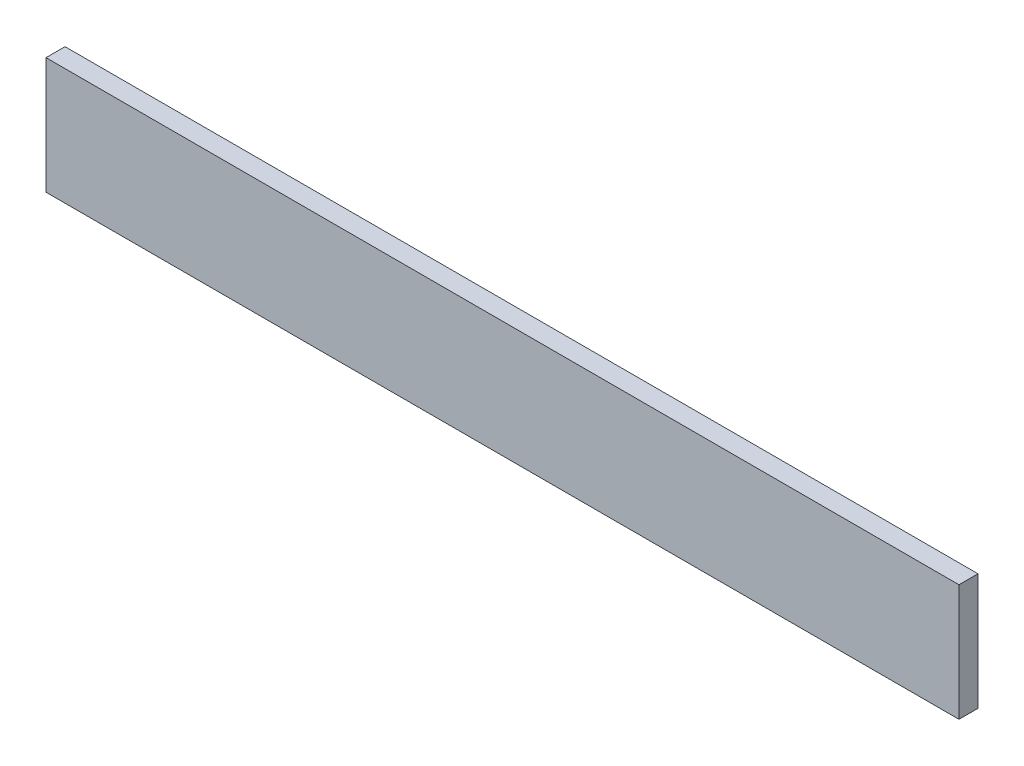
ISO-10303-21;
HEADER;
FILE_DESCRIPTION(('STEP AP214'),'2;1');
FILE_NAME('part.step','',(''),(''),'','','');
FILE_SCHEMA(('AUTOMOTIVE_DESIGN { 1 0 10303 214 1 1 1 1 }'));
ENDSEC;
DATA;
#1=APPLICATION_CONTEXT('core data for automotive mechanical design processes');
#2=APPLICATION_PROTOCOL_DEFINITION('international standard','automotive_design',2000,#1);
#3=PRODUCT_CONTEXT('',#1,'mechanical');
#4=PRODUCT('Part','Part','',(#3));
#5=PRODUCT_RELATED_PRODUCT_CATEGORY('part','',(#4));
#6=PRODUCT_DEFINITION_FORMATION('','',#4);
#7=PRODUCT_DEFINITION_CONTEXT('part definition',#1,'design');
#8=PRODUCT_DEFINITION('design','',#6,#7);
#9=PRODUCT_DEFINITION_SHAPE('','',#8);
#10=(LENGTH_UNIT() NAMED_UNIT(*) SI_UNIT(.MILLI.,.METRE.));
#11=(NAMED_UNIT(*) PLANE_ANGLE_UNIT() SI_UNIT($,.RADIAN.));
#12=(NAMED_UNIT(*) SI_UNIT($,.STERADIAN.) SOLID_ANGLE_UNIT());
#13=UNCERTAINTY_MEASURE_WITH_UNIT(LENGTH_MEASURE(1.E-05),#10,'distance_accuracy_value','');
#14=(GEOMETRIC_REPRESENTATION_CONTEXT(3) GLOBAL_UNCERTAINTY_ASSIGNED_CONTEXT((#13)) GLOBAL_UNIT_ASSIGNED_CONTEXT((#10,
#11,#12)) REPRESENTATION_CONTEXT('',''));
#15=CARTESIAN_POINT('',(0.,0.,0.));
#16=DIRECTION('',(0.,0.,1.));
#17=DIRECTION('',(1.,0.,0.));
#18=AXIS2_PLACEMENT_3D('',#15,#16,#17);
#19=CARTESIAN_POINT('',(-124.420624744802,-80.8036477042492,19.05));
#20=DIRECTION('',(0.,1.,0.));
#21=DIRECTION('',(0.,0.,1.));
#22=AXIS2_PLACEMENT_3D('',#19,#20,#21);
#23=PLANE('',#22);
#24=DIRECTION('',(1.,0.,0.));
#25=VECTOR('',#24,1.);
#26=CARTESIAN_POINT('',(-124.420624744802,-80.8036477042492,0.));
#27=LINE('',#26,#25);
#28=CARTESIAN_POINT('',(-124.420624744802,-80.8036477042492,0.));
#29=VERTEX_POINT('',#28);
#30=CARTESIAN_POINT('',(789.979375255198,-80.8036477042492,0.));
#31=VERTEX_POINT('',#30);
#32=EDGE_CURVE('E106',#29,#31,#27,.T.);
#33=ORIENTED_EDGE('',*,*,#32,.T.);
#34=DIRECTION('',(0.,0.,-1.));
#35=VECTOR('',#34,1.);
#36=CARTESIAN_POINT('',(789.979375255198,-80.8036477042492,19.05));
#37=LINE('',#36,#35);
#38=CARTESIAN_POINT('',(789.979375255198,-80.8036477042492,19.05));
#39=VERTEX_POINT('',#38);
#40=EDGE_CURVE('E11',#39,#31,#37,.T.);
#41=ORIENTED_EDGE('',*,*,#40,.F.);
#42=DIRECTION('',(1.,0.,0.));
#43=VECTOR('',#42,1.);
#44=CARTESIAN_POINT('',(-124.420624744802,-80.8036477042492,19.05));
#45=LINE('',#44,#43);
#46=CARTESIAN_POINT('',(-124.420624744802,-80.8036477042492,19.05));
#47=VERTEX_POINT('',#46);
#48=EDGE_CURVE('E79',#47,#39,#45,.T.);
#49=ORIENTED_EDGE('',*,*,#48,.F.);
#50=DIRECTION('',(0.,0.,-1.));
#51=VECTOR('',#50,1.);
#52=CARTESIAN_POINT('',(-124.420624744802,-80.8036477042492,19.05));
#53=LINE('',#52,#51);
#54=EDGE_CURVE('E102',#47,#29,#53,.T.);
#55=ORIENTED_EDGE('',*,*,#54,.T.);
#56=EDGE_LOOP('',(#33,#41,#49,#55));
#57=FACE_BOUND('',#56,.T.);
#58=ADVANCED_FACE('F39',(#57),#23,.F.);
#59=CARTESIAN_POINT('',(789.979375255198,35.9396819277508,19.05));
#60=DIRECTION('',(1.,0.,0.));
#61=DIRECTION('',(0.,0.,-1.));
#62=AXIS2_PLACEMENT_3D('',#59,#60,#61);
#63=PLANE('',#62);
#64=DIRECTION('',(0.,-1.,0.));
#65=VECTOR('',#64,1.);
#66=CARTESIAN_POINT('',(789.979375255198,35.9396819277508,0.));
#67=LINE('',#66,#65);
#68=CARTESIAN_POINT('',(789.979375255198,35.9396819277508,0.));
#69=VERTEX_POINT('',#68);
#70=EDGE_CURVE('E88',#69,#31,#67,.T.);
#71=ORIENTED_EDGE('',*,*,#70,.F.);
#72=DIRECTION('',(0.,0.,-1.));
#73=VECTOR('',#72,1.);
#74=CARTESIAN_POINT('',(789.979375255198,35.9396819277508,19.05));
#75=LINE('',#74,#73);
#76=CARTESIAN_POINT('',(789.979375255198,35.9396819277508,19.05));
#77=VERTEX_POINT('',#76);
#78=EDGE_CURVE('E48',#77,#69,#75,.T.);
#79=ORIENTED_EDGE('',*,*,#78,.F.);
#80=DIRECTION('',(0.,-1.,0.));
#81=VECTOR('',#80,1.);
#82=CARTESIAN_POINT('',(789.979375255198,35.9396819277508,19.05));
#83=LINE('',#82,#81);
#84=EDGE_CURVE('E86',#77,#39,#83,.T.);
#85=ORIENTED_EDGE('',*,*,#84,.T.);
#86=ORIENTED_EDGE('',*,*,#40,.T.);
#87=EDGE_LOOP('',(#71,#79,#85,#86));
#88=FACE_BOUND('',#87,.T.);
#89=ADVANCED_FACE('F85',(#88),#63,.T.);
#90=CARTESIAN_POINT('',(-124.420624744802,35.9396819277508,19.05));
#91=DIRECTION('',(0.,1.,0.));
#92=DIRECTION('',(0.,0.,1.));
#93=AXIS2_PLACEMENT_3D('',#90,#91,#92);
#94=PLANE('',#93);
#95=DIRECTION('',(1.,0.,0.));
#96=VECTOR('',#95,1.);
#97=CARTESIAN_POINT('',(-124.420624744802,35.9396819277508,0.));
#98=LINE('',#97,#96);
#99=CARTESIAN_POINT('',(-124.420624744802,35.9396819277508,0.));
#100=VERTEX_POINT('',#99);
#101=EDGE_CURVE('E112',#100,#69,#98,.T.);
#102=ORIENTED_EDGE('',*,*,#101,.F.);
#103=DIRECTION('',(0.,0.,-1.));
#104=VECTOR('',#103,1.);
#105=CARTESIAN_POINT('',(-124.420624744802,35.9396819277508,19.05));
#106=LINE('',#105,#104);
#107=CARTESIAN_POINT('',(-124.420624744802,35.9396819277508,19.05));
#108=VERTEX_POINT('',#107);
#109=EDGE_CURVE('E71',#108,#100,#106,.T.);
#110=ORIENTED_EDGE('',*,*,#109,.F.);
#111=DIRECTION('',(1.,0.,0.));
#112=VECTOR('',#111,1.);
#113=CARTESIAN_POINT('',(-124.420624744802,35.9396819277508,19.05));
#114=LINE('',#113,#112);
#115=EDGE_CURVE('E95',#108,#77,#114,.T.);
#116=ORIENTED_EDGE('',*,*,#115,.T.);
#117=ORIENTED_EDGE('',*,*,#78,.T.);
#118=EDGE_LOOP('',(#102,#110,#116,#117));
#119=FACE_BOUND('',#118,.T.);
#120=ADVANCED_FACE('F98',(#119),#94,.T.);
#121=CARTESIAN_POINT('',(-124.420624744802,35.9396819277508,19.05));
#122=DIRECTION('',(1.,0.,0.));
#123=DIRECTION('',(0.,1.,0.));
#124=AXIS2_PLACEMENT_3D('',#121,#122,#123);
#125=PLANE('',#124);
#126=DIRECTION('',(0.,-1.,0.));
#127=VECTOR('',#126,1.);
#128=CARTESIAN_POINT('',(-124.420624744802,35.9396819277508,0.));
#129=LINE('',#128,#127);
#130=EDGE_CURVE('E74',#100,#29,#129,.T.);
#131=ORIENTED_EDGE('',*,*,#130,.T.);
#132=ORIENTED_EDGE('',*,*,#54,.F.);
#133=DIRECTION('',(0.,-1.,0.));
#134=VECTOR('',#133,1.);
#135=CARTESIAN_POINT('',(-124.420624744802,35.9396819277508,19.05));
#136=LINE('',#135,#134);
#137=EDGE_CURVE('E56',#108,#47,#136,.T.);
#138=ORIENTED_EDGE('',*,*,#137,.F.);
#139=ORIENTED_EDGE('',*,*,#109,.T.);
#140=EDGE_LOOP('',(#131,#132,#138,#139));
#141=FACE_BOUND('',#140,.T.);
#142=ADVANCED_FACE('F129',(#141),#125,.F.);
#143=CARTESIAN_POINT('',(0.,0.,19.05));
#144=DIRECTION('',(0.,0.,-1.));
#145=DIRECTION('',(-1.,0.,0.));
#146=AXIS2_PLACEMENT_3D('',#143,#144,#145);
#147=PLANE('',#146);
#148=ORIENTED_EDGE('',*,*,#48,.T.);
#149=ORIENTED_EDGE('',*,*,#84,.F.);
#150=ORIENTED_EDGE('',*,*,#115,.F.);
#151=ORIENTED_EDGE('',*,*,#137,.T.);
#152=EDGE_LOOP('',(#148,#149,#150,#151));
#153=FACE_BOUND('',#152,.T.);
#154=ADVANCED_FACE('F94',(#153),#147,.F.);
#155=CARTESIAN_POINT('',(0.,0.,0.));
#156=DIRECTION('',(0.,0.,-1.));
#157=DIRECTION('',(-1.,0.,0.));
#158=AXIS2_PLACEMENT_3D('',#155,#156,#157);
#159=PLANE('',#158);
#160=ORIENTED_EDGE('',*,*,#32,.F.);
#161=ORIENTED_EDGE('',*,*,#130,.F.);
#162=ORIENTED_EDGE('',*,*,#101,.T.);
#163=ORIENTED_EDGE('',*,*,#70,.T.);
#164=EDGE_LOOP('',(#160,#161,#162,#163));
#165=FACE_BOUND('',#164,.T.);
#166=ADVANCED_FACE('F123',(#165),#159,.T.);
#167=CLOSED_SHELL('',(#58,#89,#120,#142,#154,#166));
#168=MANIFOLD_SOLID_BREP('B2',#167);
#169=ADVANCED_BREP_SHAPE_REPRESENTATION('',(#18,#168),#14);
#170=SHAPE_DEFINITION_REPRESENTATION(#9,#169);
ENDSEC;
END-ISO-10303-21;
